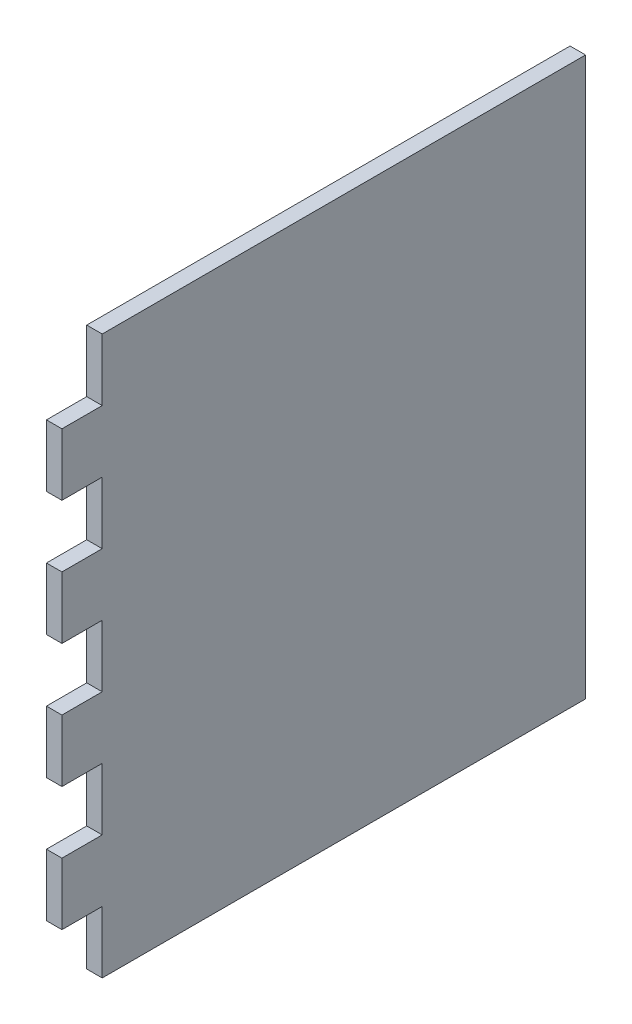
ISO-10303-21;
HEADER;
FILE_DESCRIPTION(('STEP AP214'),'2;1');
FILE_NAME('part.step','',(''),(''),'','','');
FILE_SCHEMA(('AUTOMOTIVE_DESIGN { 1 0 10303 214 1 1 1 1 }'));
ENDSEC;
DATA;
#1=APPLICATION_CONTEXT('core data for automotive mechanical design processes');
#2=APPLICATION_PROTOCOL_DEFINITION('international standard','automotive_design',2000,#1);
#3=PRODUCT_CONTEXT('',#1,'mechanical');
#4=PRODUCT('Part','Part','',(#3));
#5=PRODUCT_RELATED_PRODUCT_CATEGORY('part','',(#4));
#6=PRODUCT_DEFINITION_FORMATION('','',#4);
#7=PRODUCT_DEFINITION_CONTEXT('part definition',#1,'design');
#8=PRODUCT_DEFINITION('design','',#6,#7);
#9=PRODUCT_DEFINITION_SHAPE('','',#8);
#10=(LENGTH_UNIT() NAMED_UNIT(*) SI_UNIT(.MILLI.,.METRE.));
#11=(NAMED_UNIT(*) PLANE_ANGLE_UNIT() SI_UNIT($,.RADIAN.));
#12=(NAMED_UNIT(*) SI_UNIT($,.STERADIAN.) SOLID_ANGLE_UNIT());
#13=UNCERTAINTY_MEASURE_WITH_UNIT(LENGTH_MEASURE(1.E-05),#10,'distance_accuracy_value','');
#14=(GEOMETRIC_REPRESENTATION_CONTEXT(3) GLOBAL_UNCERTAINTY_ASSIGNED_CONTEXT((#13)) GLOBAL_UNIT_ASSIGNED_CONTEXT((#10,
#11,#12)) REPRESENTATION_CONTEXT('',''));
#15=CARTESIAN_POINT('',(0.,0.,0.));
#16=DIRECTION('',(0.,0.,1.));
#17=DIRECTION('',(1.,0.,0.));
#18=AXIS2_PLACEMENT_3D('',#15,#16,#17);
#19=CARTESIAN_POINT('',(6.35,-114.3,-99.06));
#20=DIRECTION('',(0.,0.,1.));
#21=DIRECTION('',(1.,0.,0.));
#22=AXIS2_PLACEMENT_3D('',#19,#20,#21);
#23=PLANE('',#22);
#24=DIRECTION('',(0.,1.,0.));
#25=VECTOR('',#24,1.);
#26=CARTESIAN_POINT('',(0.,-114.3,-99.06));
#27=LINE('',#26,#25);
#28=CARTESIAN_POINT('',(0.,-114.3,-99.06));
#29=VERTEX_POINT('',#28);
#30=CARTESIAN_POINT('',(0.,114.3,-99.06));
#31=VERTEX_POINT('',#30);
#32=EDGE_CURVE('E201',#29,#31,#27,.T.);
#33=ORIENTED_EDGE('',*,*,#32,.T.);
#34=DIRECTION('',(-1.,0.,0.));
#35=VECTOR('',#34,1.);
#36=CARTESIAN_POINT('',(6.35,114.3,-99.06));
#37=LINE('',#36,#35);
#38=CARTESIAN_POINT('',(6.35,114.3,-99.06));
#39=VERTEX_POINT('',#38);
#40=EDGE_CURVE('E11',#39,#31,#37,.T.);
#41=ORIENTED_EDGE('',*,*,#40,.F.);
#42=DIRECTION('',(0.,1.,0.));
#43=VECTOR('',#42,1.);
#44=CARTESIAN_POINT('',(6.35,-114.3,-99.06));
#45=LINE('',#44,#43);
#46=CARTESIAN_POINT('',(6.35,-114.3,-99.06));
#47=VERTEX_POINT('',#46);
#48=EDGE_CURVE('E239',#47,#39,#45,.T.);
#49=ORIENTED_EDGE('',*,*,#48,.F.);
#50=DIRECTION('',(-1.,0.,0.));
#51=VECTOR('',#50,1.);
#52=CARTESIAN_POINT('',(6.35,-114.3,-99.06));
#53=LINE('',#52,#51);
#54=EDGE_CURVE('E197',#47,#29,#53,.T.);
#55=ORIENTED_EDGE('',*,*,#54,.T.);
#56=EDGE_LOOP('',(#33,#41,#49,#55));
#57=FACE_BOUND('',#56,.T.);
#58=ADVANCED_FACE('F33',(#57),#23,.F.);
#59=CARTESIAN_POINT('',(6.35,114.3,99.06));
#60=DIRECTION('',(0.,-1.,0.));
#61=DIRECTION('',(0.,0.,-1.));
#62=AXIS2_PLACEMENT_3D('',#59,#60,#61);
#63=PLANE('',#62);
#64=DIRECTION('',(0.,0.,1.));
#65=VECTOR('',#64,1.);
#66=CARTESIAN_POINT('',(0.,114.3,99.06));
#67=LINE('',#66,#65);
#68=CARTESIAN_POINT('',(0.,114.3,99.06));
#69=VERTEX_POINT('',#68);
#70=EDGE_CURVE('E204',#31,#69,#67,.T.);
#71=ORIENTED_EDGE('',*,*,#70,.T.);
#72=DIRECTION('',(-1.,0.,0.));
#73=VECTOR('',#72,1.);
#74=CARTESIAN_POINT('',(6.35,114.3,99.06));
#75=LINE('',#74,#73);
#76=CARTESIAN_POINT('',(6.35,114.3,99.06));
#77=VERTEX_POINT('',#76);
#78=EDGE_CURVE('E41',#77,#69,#75,.T.);
#79=ORIENTED_EDGE('',*,*,#78,.F.);
#80=DIRECTION('',(0.,0.,1.));
#81=VECTOR('',#80,1.);
#82=CARTESIAN_POINT('',(6.35,114.3,99.06));
#83=LINE('',#82,#81);
#84=EDGE_CURVE('E128',#39,#77,#83,.T.);
#85=ORIENTED_EDGE('',*,*,#84,.F.);
#86=ORIENTED_EDGE('',*,*,#40,.T.);
#87=EDGE_LOOP('',(#71,#79,#85,#86));
#88=FACE_BOUND('',#87,.T.);
#89=ADVANCED_FACE('F357',(#88),#63,.F.);
#90=CARTESIAN_POINT('',(6.35,88.9,99.06));
#91=DIRECTION('',(0.,0.,-1.));
#92=DIRECTION('',(-1.,0.,0.));
#93=AXIS2_PLACEMENT_3D('',#90,#91,#92);
#94=PLANE('',#93);
#95=DIRECTION('',(0.,-1.,0.));
#96=VECTOR('',#95,1.);
#97=CARTESIAN_POINT('',(0.,88.9,99.06));
#98=LINE('',#97,#96);
#99=CARTESIAN_POINT('',(0.,88.9,99.06));
#100=VERTEX_POINT('',#99);
#101=EDGE_CURVE('E206',#69,#100,#98,.T.);
#102=ORIENTED_EDGE('',*,*,#101,.T.);
#103=DIRECTION('',(-1.,0.,0.));
#104=VECTOR('',#103,1.);
#105=CARTESIAN_POINT('',(6.35,88.9,99.06));
#106=LINE('',#105,#104);
#107=CARTESIAN_POINT('',(6.35,88.9,99.06));
#108=VERTEX_POINT('',#107);
#109=EDGE_CURVE('E282',#108,#100,#106,.T.);
#110=ORIENTED_EDGE('',*,*,#109,.F.);
#111=DIRECTION('',(0.,-1.,0.));
#112=VECTOR('',#111,1.);
#113=CARTESIAN_POINT('',(6.35,88.9,99.06));
#114=LINE('',#113,#112);
#115=EDGE_CURVE('E290',#77,#108,#114,.T.);
#116=ORIENTED_EDGE('',*,*,#115,.F.);
#117=ORIENTED_EDGE('',*,*,#78,.T.);
#118=EDGE_LOOP('',(#102,#110,#116,#117));
#119=FACE_BOUND('',#118,.T.);
#120=ADVANCED_FACE('F288',(#119),#94,.F.);
#121=CARTESIAN_POINT('',(6.35,88.9,99.06));
#122=DIRECTION('',(0.,-1.,0.));
#123=DIRECTION('',(0.,0.,-1.));
#124=AXIS2_PLACEMENT_3D('',#121,#122,#123);
#125=PLANE('',#124);
#126=DIRECTION('',(0.,0.,1.));
#127=VECTOR('',#126,1.);
#128=CARTESIAN_POINT('',(0.,88.9,99.06));
#129=LINE('',#128,#127);
#130=CARTESIAN_POINT('',(0.,88.9,115.57));
#131=VERTEX_POINT('',#130);
#132=EDGE_CURVE('E208',#100,#131,#129,.T.);
#133=ORIENTED_EDGE('',*,*,#132,.T.);
#134=DIRECTION('',(-1.,0.,0.));
#135=VECTOR('',#134,1.);
#136=CARTESIAN_POINT('',(6.35,88.9,115.57));
#137=LINE('',#136,#135);
#138=CARTESIAN_POINT('',(6.35,88.9,115.57));
#139=VERTEX_POINT('',#138);
#140=EDGE_CURVE('E279',#139,#131,#137,.T.);
#141=ORIENTED_EDGE('',*,*,#140,.F.);
#142=DIRECTION('',(0.,0.,1.));
#143=VECTOR('',#142,1.);
#144=CARTESIAN_POINT('',(6.35,88.9,99.06));
#145=LINE('',#144,#143);
#146=EDGE_CURVE('E308',#108,#139,#145,.T.);
#147=ORIENTED_EDGE('',*,*,#146,.F.);
#148=ORIENTED_EDGE('',*,*,#109,.T.);
#149=EDGE_LOOP('',(#133,#141,#147,#148));
#150=FACE_BOUND('',#149,.T.);
#151=ADVANCED_FACE('F299',(#150),#125,.F.);
#152=CARTESIAN_POINT('',(6.35,88.9,115.57));
#153=DIRECTION('',(0.,0.,-1.));
#154=DIRECTION('',(0.,1.,0.));
#155=AXIS2_PLACEMENT_3D('',#152,#153,#154);
#156=PLANE('',#155);
#157=DIRECTION('',(0.,-1.,0.));
#158=VECTOR('',#157,1.);
#159=CARTESIAN_POINT('',(0.,88.9,115.57));
#160=LINE('',#159,#158);
#161=CARTESIAN_POINT('',(0.,63.5,115.57));
#162=VERTEX_POINT('',#161);
#163=EDGE_CURVE('E210',#131,#162,#160,.T.);
#164=ORIENTED_EDGE('',*,*,#163,.T.);
#165=DIRECTION('',(-1.,0.,0.));
#166=VECTOR('',#165,1.);
#167=CARTESIAN_POINT('',(6.35,63.5,115.57));
#168=LINE('',#167,#166);
#169=CARTESIAN_POINT('',(6.35,63.5,115.57));
#170=VERTEX_POINT('',#169);
#171=EDGE_CURVE('E276',#170,#162,#168,.T.);
#172=ORIENTED_EDGE('',*,*,#171,.F.);
#173=DIRECTION('',(0.,-1.,0.));
#174=VECTOR('',#173,1.);
#175=CARTESIAN_POINT('',(6.35,88.9,115.57));
#176=LINE('',#175,#174);
#177=EDGE_CURVE('E305',#139,#170,#176,.T.);
#178=ORIENTED_EDGE('',*,*,#177,.F.);
#179=ORIENTED_EDGE('',*,*,#140,.T.);
#180=EDGE_LOOP('',(#164,#172,#178,#179));
#181=FACE_BOUND('',#180,.T.);
#182=ADVANCED_FACE('F303',(#181),#156,.F.);
#183=CARTESIAN_POINT('',(6.35,63.5,99.06));
#184=DIRECTION('',(0.,1.,0.));
#185=DIRECTION('',(0.,0.,1.));
#186=AXIS2_PLACEMENT_3D('',#183,#184,#185);
#187=PLANE('',#186);
#188=DIRECTION('',(0.,0.,-1.));
#189=VECTOR('',#188,1.);
#190=CARTESIAN_POINT('',(0.,63.5,99.06));
#191=LINE('',#190,#189);
#192=CARTESIAN_POINT('',(0.,63.5,99.06));
#193=VERTEX_POINT('',#192);
#194=EDGE_CURVE('E212',#162,#193,#191,.T.);
#195=ORIENTED_EDGE('',*,*,#194,.T.);
#196=DIRECTION('',(-1.,0.,0.));
#197=VECTOR('',#196,1.);
#198=CARTESIAN_POINT('',(6.35,63.5,99.06));
#199=LINE('',#198,#197);
#200=CARTESIAN_POINT('',(6.35,63.5,99.06));
#201=VERTEX_POINT('',#200);
#202=EDGE_CURVE('E273',#201,#193,#199,.T.);
#203=ORIENTED_EDGE('',*,*,#202,.F.);
#204=DIRECTION('',(0.,0.,-1.));
#205=VECTOR('',#204,1.);
#206=CARTESIAN_POINT('',(6.35,63.5,99.06));
#207=LINE('',#206,#205);
#208=EDGE_CURVE('E307',#170,#201,#207,.T.);
#209=ORIENTED_EDGE('',*,*,#208,.F.);
#210=ORIENTED_EDGE('',*,*,#171,.T.);
#211=EDGE_LOOP('',(#195,#203,#209,#210));
#212=FACE_BOUND('',#211,.T.);
#213=ADVANCED_FACE('F370',(#212),#187,.F.);
#214=CARTESIAN_POINT('',(6.35,38.1,99.0599999999995));
#215=DIRECTION('',(0.,0.,-1.));
#216=DIRECTION('',(0.,1.,0.));
#217=AXIS2_PLACEMENT_3D('',#214,#215,#216);
#218=PLANE('',#217);
#219=DIRECTION('',(0.,-1.,0.));
#220=VECTOR('',#219,1.);
#221=CARTESIAN_POINT('',(0.,38.1,99.0599999999995));
#222=LINE('',#221,#220);
#223=CARTESIAN_POINT('',(0.,38.1,99.0599999999995));
#224=VERTEX_POINT('',#223);
#225=EDGE_CURVE('E214',#193,#224,#222,.T.);
#226=ORIENTED_EDGE('',*,*,#225,.T.);
#227=DIRECTION('',(-1.,0.,0.));
#228=VECTOR('',#227,1.);
#229=CARTESIAN_POINT('',(6.35,38.1,99.0599999999995));
#230=LINE('',#229,#228);
#231=CARTESIAN_POINT('',(6.35,38.1,99.0599999999995));
#232=VERTEX_POINT('',#231);
#233=EDGE_CURVE('E270',#232,#224,#230,.T.);
#234=ORIENTED_EDGE('',*,*,#233,.F.);
#235=DIRECTION('',(0.,-1.,0.));
#236=VECTOR('',#235,1.);
#237=CARTESIAN_POINT('',(6.35,38.1,99.0599999999995));
#238=LINE('',#237,#236);
#239=EDGE_CURVE('E310',#201,#232,#238,.T.);
#240=ORIENTED_EDGE('',*,*,#239,.F.);
#241=ORIENTED_EDGE('',*,*,#202,.T.);
#242=EDGE_LOOP('',(#226,#234,#240,#241));
#243=FACE_BOUND('',#242,.T.);
#244=ADVANCED_FACE('F373',(#243),#218,.F.);
#245=CARTESIAN_POINT('',(6.35,38.1,99.0599999999995));
#246=DIRECTION('',(0.,-1.,0.));
#247=DIRECTION('',(0.,0.,-1.));
#248=AXIS2_PLACEMENT_3D('',#245,#246,#247);
#249=PLANE('',#248);
#250=DIRECTION('',(0.,0.,1.));
#251=VECTOR('',#250,1.);
#252=CARTESIAN_POINT('',(0.,38.1,99.0599999999995));
#253=LINE('',#252,#251);
#254=CARTESIAN_POINT('',(0.,38.1,115.569999999999));
#255=VERTEX_POINT('',#254);
#256=EDGE_CURVE('E216',#224,#255,#253,.T.);
#257=ORIENTED_EDGE('',*,*,#256,.T.);
#258=DIRECTION('',(-1.,0.,0.));
#259=VECTOR('',#258,1.);
#260=CARTESIAN_POINT('',(6.35,38.1,115.569999999999));
#261=LINE('',#260,#259);
#262=CARTESIAN_POINT('',(6.35,38.1,115.569999999999));
#263=VERTEX_POINT('',#262);
#264=EDGE_CURVE('E267',#263,#255,#261,.T.);
#265=ORIENTED_EDGE('',*,*,#264,.F.);
#266=DIRECTION('',(0.,0.,1.));
#267=VECTOR('',#266,1.);
#268=CARTESIAN_POINT('',(6.35,38.1,99.0599999999995));
#269=LINE('',#268,#267);
#270=EDGE_CURVE('E316',#232,#263,#269,.T.);
#271=ORIENTED_EDGE('',*,*,#270,.F.);
#272=ORIENTED_EDGE('',*,*,#233,.T.);
#273=EDGE_LOOP('',(#257,#265,#271,#272));
#274=FACE_BOUND('',#273,.T.);
#275=ADVANCED_FACE('F377',(#274),#249,.F.);
#276=CARTESIAN_POINT('',(6.35,38.1,115.569999999999));
#277=DIRECTION('',(0.,0.,-1.));
#278=DIRECTION('',(0.,1.,0.));
#279=AXIS2_PLACEMENT_3D('',#276,#277,#278);
#280=PLANE('',#279);
#281=DIRECTION('',(0.,-1.,0.));
#282=VECTOR('',#281,1.);
#283=CARTESIAN_POINT('',(0.,38.1,115.569999999999));
#284=LINE('',#283,#282);
#285=CARTESIAN_POINT('',(0.,12.7,115.569999999999));
#286=VERTEX_POINT('',#285);
#287=EDGE_CURVE('E218',#255,#286,#284,.T.);
#288=ORIENTED_EDGE('',*,*,#287,.T.);
#289=DIRECTION('',(-1.,0.,0.));
#290=VECTOR('',#289,1.);
#291=CARTESIAN_POINT('',(6.35,12.7,115.569999999999));
#292=LINE('',#291,#290);
#293=CARTESIAN_POINT('',(6.35,12.7,115.569999999999));
#294=VERTEX_POINT('',#293);
#295=EDGE_CURVE('E264',#294,#286,#292,.T.);
#296=ORIENTED_EDGE('',*,*,#295,.F.);
#297=DIRECTION('',(0.,-1.,0.));
#298=VECTOR('',#297,1.);
#299=CARTESIAN_POINT('',(6.35,38.1,115.569999999999));
#300=LINE('',#299,#298);
#301=EDGE_CURVE('E318',#263,#294,#300,.T.);
#302=ORIENTED_EDGE('',*,*,#301,.F.);
#303=ORIENTED_EDGE('',*,*,#264,.T.);
#304=EDGE_LOOP('',(#288,#296,#302,#303));
#305=FACE_BOUND('',#304,.T.);
#306=ADVANCED_FACE('F381',(#305),#280,.F.);
#307=CARTESIAN_POINT('',(6.35,12.7,99.0599999999995));
#308=DIRECTION('',(0.,1.,0.));
#309=DIRECTION('',(0.,0.,1.));
#310=AXIS2_PLACEMENT_3D('',#307,#308,#309);
#311=PLANE('',#310);
#312=DIRECTION('',(0.,0.,-1.));
#313=VECTOR('',#312,1.);
#314=CARTESIAN_POINT('',(0.,12.7,99.0599999999995));
#315=LINE('',#314,#313);
#316=CARTESIAN_POINT('',(0.,12.7,99.0599999999995));
#317=VERTEX_POINT('',#316);
#318=EDGE_CURVE('E220',#286,#317,#315,.T.);
#319=ORIENTED_EDGE('',*,*,#318,.T.);
#320=DIRECTION('',(-1.,0.,0.));
#321=VECTOR('',#320,1.);
#322=CARTESIAN_POINT('',(6.35,12.7,99.0599999999995));
#323=LINE('',#322,#321);
#324=CARTESIAN_POINT('',(6.35,12.7,99.0599999999995));
#325=VERTEX_POINT('',#324);
#326=EDGE_CURVE('E261',#325,#317,#323,.T.);
#327=ORIENTED_EDGE('',*,*,#326,.F.);
#328=DIRECTION('',(0.,0.,-1.));
#329=VECTOR('',#328,1.);
#330=CARTESIAN_POINT('',(6.35,12.7,99.0599999999995));
#331=LINE('',#330,#329);
#332=EDGE_CURVE('E320',#294,#325,#331,.T.);
#333=ORIENTED_EDGE('',*,*,#332,.F.);
#334=ORIENTED_EDGE('',*,*,#295,.T.);
#335=EDGE_LOOP('',(#319,#327,#333,#334));
#336=FACE_BOUND('',#335,.T.);
#337=ADVANCED_FACE('F385',(#336),#311,.F.);
#338=CARTESIAN_POINT('',(6.35,-12.7,99.0599999999989));
#339=DIRECTION('',(0.,0.,-1.));
#340=DIRECTION('',(0.,1.,0.));
#341=AXIS2_PLACEMENT_3D('',#338,#339,#340);
#342=PLANE('',#341);
#343=DIRECTION('',(0.,-1.,0.));
#344=VECTOR('',#343,1.);
#345=CARTESIAN_POINT('',(0.,-12.7,99.0599999999989));
#346=LINE('',#345,#344);
#347=CARTESIAN_POINT('',(0.,-12.7,99.0599999999989));
#348=VERTEX_POINT('',#347);
#349=EDGE_CURVE('E222',#317,#348,#346,.T.);
#350=ORIENTED_EDGE('',*,*,#349,.T.);
#351=DIRECTION('',(-1.,0.,0.));
#352=VECTOR('',#351,1.);
#353=CARTESIAN_POINT('',(6.35,-12.7,99.0599999999989));
#354=LINE('',#353,#352);
#355=CARTESIAN_POINT('',(6.35,-12.7,99.0599999999989));
#356=VERTEX_POINT('',#355);
#357=EDGE_CURVE('E258',#356,#348,#354,.T.);
#358=ORIENTED_EDGE('',*,*,#357,.F.);
#359=DIRECTION('',(0.,-1.,0.));
#360=VECTOR('',#359,1.);
#361=CARTESIAN_POINT('',(6.35,-12.7,99.0599999999989));
#362=LINE('',#361,#360);
#363=EDGE_CURVE('E322',#325,#356,#362,.T.);
#364=ORIENTED_EDGE('',*,*,#363,.F.);
#365=ORIENTED_EDGE('',*,*,#326,.T.);
#366=EDGE_LOOP('',(#350,#358,#364,#365));
#367=FACE_BOUND('',#366,.T.);
#368=ADVANCED_FACE('F389',(#367),#342,.F.);
#369=CARTESIAN_POINT('',(6.35,-12.7,99.0599999999989));
#370=DIRECTION('',(0.,-1.,0.));
#371=DIRECTION('',(0.,0.,-1.));
#372=AXIS2_PLACEMENT_3D('',#369,#370,#371);
#373=PLANE('',#372);
#374=DIRECTION('',(0.,0.,1.));
#375=VECTOR('',#374,1.);
#376=CARTESIAN_POINT('',(0.,-12.7,99.0599999999989));
#377=LINE('',#376,#375);
#378=CARTESIAN_POINT('',(0.,-12.7,115.569999999999));
#379=VERTEX_POINT('',#378);
#380=EDGE_CURVE('E224',#348,#379,#377,.T.);
#381=ORIENTED_EDGE('',*,*,#380,.T.);
#382=DIRECTION('',(-1.,0.,0.));
#383=VECTOR('',#382,1.);
#384=CARTESIAN_POINT('',(6.35,-12.7,115.569999999999));
#385=LINE('',#384,#383);
#386=CARTESIAN_POINT('',(6.35,-12.7,115.569999999999));
#387=VERTEX_POINT('',#386);
#388=EDGE_CURVE('E255',#387,#379,#385,.T.);
#389=ORIENTED_EDGE('',*,*,#388,.F.);
#390=DIRECTION('',(0.,0.,1.));
#391=VECTOR('',#390,1.);
#392=CARTESIAN_POINT('',(6.35,-12.7,99.0599999999989));
#393=LINE('',#392,#391);
#394=EDGE_CURVE('E324',#356,#387,#393,.T.);
#395=ORIENTED_EDGE('',*,*,#394,.F.);
#396=ORIENTED_EDGE('',*,*,#357,.T.);
#397=EDGE_LOOP('',(#381,#389,#395,#396));
#398=FACE_BOUND('',#397,.T.);
#399=ADVANCED_FACE('F393',(#398),#373,.F.);
#400=CARTESIAN_POINT('',(6.35,-12.7,115.569999999999));
#401=DIRECTION('',(0.,0.,-1.));
#402=DIRECTION('',(0.,1.,0.));
#403=AXIS2_PLACEMENT_3D('',#400,#401,#402);
#404=PLANE('',#403);
#405=DIRECTION('',(0.,-1.,0.));
#406=VECTOR('',#405,1.);
#407=CARTESIAN_POINT('',(0.,-12.7,115.569999999999));
#408=LINE('',#407,#406);
#409=CARTESIAN_POINT('',(0.,-38.1,115.569999999999));
#410=VERTEX_POINT('',#409);
#411=EDGE_CURVE('E226',#379,#410,#408,.T.);
#412=ORIENTED_EDGE('',*,*,#411,.T.);
#413=DIRECTION('',(-1.,0.,0.));
#414=VECTOR('',#413,1.);
#415=CARTESIAN_POINT('',(6.35,-38.1,115.569999999999));
#416=LINE('',#415,#414);
#417=CARTESIAN_POINT('',(6.35,-38.1,115.569999999999));
#418=VERTEX_POINT('',#417);
#419=EDGE_CURVE('E252',#418,#410,#416,.T.);
#420=ORIENTED_EDGE('',*,*,#419,.F.);
#421=DIRECTION('',(0.,-1.,0.));
#422=VECTOR('',#421,1.);
#423=CARTESIAN_POINT('',(6.35,-12.7,115.569999999999));
#424=LINE('',#423,#422);
#425=EDGE_CURVE('E326',#387,#418,#424,.T.);
#426=ORIENTED_EDGE('',*,*,#425,.F.);
#427=ORIENTED_EDGE('',*,*,#388,.T.);
#428=EDGE_LOOP('',(#412,#420,#426,#427));
#429=FACE_BOUND('',#428,.T.);
#430=ADVANCED_FACE('F397',(#429),#404,.F.);
#431=CARTESIAN_POINT('',(6.35,-38.1,99.0599999999989));
#432=DIRECTION('',(0.,1.,0.));
#433=DIRECTION('',(0.,0.,1.));
#434=AXIS2_PLACEMENT_3D('',#431,#432,#433);
#435=PLANE('',#434);
#436=DIRECTION('',(0.,0.,-1.));
#437=VECTOR('',#436,1.);
#438=CARTESIAN_POINT('',(0.,-38.1,99.0599999999989));
#439=LINE('',#438,#437);
#440=CARTESIAN_POINT('',(0.,-38.1,99.0599999999989));
#441=VERTEX_POINT('',#440);
#442=EDGE_CURVE('E228',#410,#441,#439,.T.);
#443=ORIENTED_EDGE('',*,*,#442,.T.);
#444=DIRECTION('',(-1.,0.,0.));
#445=VECTOR('',#444,1.);
#446=CARTESIAN_POINT('',(6.35,-38.1,99.0599999999989));
#447=LINE('',#446,#445);
#448=CARTESIAN_POINT('',(6.35,-38.1,99.0599999999989));
#449=VERTEX_POINT('',#448);
#450=EDGE_CURVE('E249',#449,#441,#447,.T.);
#451=ORIENTED_EDGE('',*,*,#450,.F.);
#452=DIRECTION('',(0.,0.,-1.));
#453=VECTOR('',#452,1.);
#454=CARTESIAN_POINT('',(6.35,-38.1,99.0599999999989));
#455=LINE('',#454,#453);
#456=EDGE_CURVE('E328',#418,#449,#455,.T.);
#457=ORIENTED_EDGE('',*,*,#456,.F.);
#458=ORIENTED_EDGE('',*,*,#419,.T.);
#459=EDGE_LOOP('',(#443,#451,#457,#458));
#460=FACE_BOUND('',#459,.T.);
#461=ADVANCED_FACE('F401',(#460),#435,.F.);
#462=CARTESIAN_POINT('',(6.35,-63.5,99.0599999999984));
#463=DIRECTION('',(0.,0.,-1.));
#464=DIRECTION('',(0.,1.,0.));
#465=AXIS2_PLACEMENT_3D('',#462,#463,#464);
#466=PLANE('',#465);
#467=DIRECTION('',(0.,-1.,0.));
#468=VECTOR('',#467,1.);
#469=CARTESIAN_POINT('',(0.,-63.5,99.0599999999984));
#470=LINE('',#469,#468);
#471=CARTESIAN_POINT('',(0.,-63.5,99.0599999999984));
#472=VERTEX_POINT('',#471);
#473=EDGE_CURVE('E230',#441,#472,#470,.T.);
#474=ORIENTED_EDGE('',*,*,#473,.T.);
#475=DIRECTION('',(-1.,0.,0.));
#476=VECTOR('',#475,1.);
#477=CARTESIAN_POINT('',(6.35,-63.5,99.0599999999984));
#478=LINE('',#477,#476);
#479=CARTESIAN_POINT('',(6.35,-63.5,99.0599999999984));
#480=VERTEX_POINT('',#479);
#481=EDGE_CURVE('E246',#480,#472,#478,.T.);
#482=ORIENTED_EDGE('',*,*,#481,.F.);
#483=DIRECTION('',(0.,-1.,0.));
#484=VECTOR('',#483,1.);
#485=CARTESIAN_POINT('',(6.35,-63.5,99.0599999999984));
#486=LINE('',#485,#484);
#487=EDGE_CURVE('E330',#449,#480,#486,.T.);
#488=ORIENTED_EDGE('',*,*,#487,.F.);
#489=ORIENTED_EDGE('',*,*,#450,.T.);
#490=EDGE_LOOP('',(#474,#482,#488,#489));
#491=FACE_BOUND('',#490,.T.);
#492=ADVANCED_FACE('F405',(#491),#466,.F.);
#493=CARTESIAN_POINT('',(6.35,-63.5,99.0599999999984));
#494=DIRECTION('',(0.,-1.,0.));
#495=DIRECTION('',(0.,0.,-1.));
#496=AXIS2_PLACEMENT_3D('',#493,#494,#495);
#497=PLANE('',#496);
#498=DIRECTION('',(0.,0.,1.));
#499=VECTOR('',#498,1.);
#500=CARTESIAN_POINT('',(0.,-63.5,99.0599999999984));
#501=LINE('',#500,#499);
#502=CARTESIAN_POINT('',(0.,-63.5,115.569999999998));
#503=VERTEX_POINT('',#502);
#504=EDGE_CURVE('E232',#472,#503,#501,.T.);
#505=ORIENTED_EDGE('',*,*,#504,.T.);
#506=DIRECTION('',(-1.,0.,0.));
#507=VECTOR('',#506,1.);
#508=CARTESIAN_POINT('',(6.35,-63.5,115.569999999998));
#509=LINE('',#508,#507);
#510=CARTESIAN_POINT('',(6.35,-63.5,115.569999999998));
#511=VERTEX_POINT('',#510);
#512=EDGE_CURVE('E243',#511,#503,#509,.T.);
#513=ORIENTED_EDGE('',*,*,#512,.F.);
#514=DIRECTION('',(0.,0.,1.));
#515=VECTOR('',#514,1.);
#516=CARTESIAN_POINT('',(6.35,-63.5,99.0599999999984));
#517=LINE('',#516,#515);
#518=EDGE_CURVE('E332',#480,#511,#517,.T.);
#519=ORIENTED_EDGE('',*,*,#518,.F.);
#520=ORIENTED_EDGE('',*,*,#481,.T.);
#521=EDGE_LOOP('',(#505,#513,#519,#520));
#522=FACE_BOUND('',#521,.T.);
#523=ADVANCED_FACE('F338',(#522),#497,.F.);
#524=CARTESIAN_POINT('',(6.35,-63.5,115.569999999998));
#525=DIRECTION('',(0.,0.,-1.));
#526=DIRECTION('',(0.,1.,0.));
#527=AXIS2_PLACEMENT_3D('',#524,#525,#526);
#528=PLANE('',#527);
#529=DIRECTION('',(0.,-1.,0.));
#530=VECTOR('',#529,1.);
#531=CARTESIAN_POINT('',(0.,-63.5,115.569999999998));
#532=LINE('',#531,#530);
#533=CARTESIAN_POINT('',(0.,-88.9,115.569999999998));
#534=VERTEX_POINT('',#533);
#535=EDGE_CURVE('E234',#503,#534,#532,.T.);
#536=ORIENTED_EDGE('',*,*,#535,.T.);
#537=DIRECTION('',(-1.,0.,0.));
#538=VECTOR('',#537,1.);
#539=CARTESIAN_POINT('',(6.35,-88.9,115.569999999998));
#540=LINE('',#539,#538);
#541=CARTESIAN_POINT('',(6.35,-88.9,115.569999999998));
#542=VERTEX_POINT('',#541);
#543=EDGE_CURVE('E192',#542,#534,#540,.T.);
#544=ORIENTED_EDGE('',*,*,#543,.F.);
#545=DIRECTION('',(0.,-1.,0.));
#546=VECTOR('',#545,1.);
#547=CARTESIAN_POINT('',(6.35,-63.5,115.569999999998));
#548=LINE('',#547,#546);
#549=EDGE_CURVE('E183',#511,#542,#548,.T.);
#550=ORIENTED_EDGE('',*,*,#549,.F.);
#551=ORIENTED_EDGE('',*,*,#512,.T.);
#552=EDGE_LOOP('',(#536,#544,#550,#551));
#553=FACE_BOUND('',#552,.T.);
#554=ADVANCED_FACE('F342',(#553),#528,.F.);
#555=CARTESIAN_POINT('',(6.35,-88.9,99.0599999999984));
#556=DIRECTION('',(0.,1.,0.));
#557=DIRECTION('',(0.,0.,1.));
#558=AXIS2_PLACEMENT_3D('',#555,#556,#557);
#559=PLANE('',#558);
#560=DIRECTION('',(0.,0.,-1.));
#561=VECTOR('',#560,1.);
#562=CARTESIAN_POINT('',(0.,-88.9,99.0599999999984));
#563=LINE('',#562,#561);
#564=CARTESIAN_POINT('',(0.,-88.9,99.0599999999984));
#565=VERTEX_POINT('',#564);
#566=EDGE_CURVE('E191',#534,#565,#563,.T.);
#567=ORIENTED_EDGE('',*,*,#566,.T.);
#568=DIRECTION('',(-1.,0.,0.));
#569=VECTOR('',#568,1.);
#570=CARTESIAN_POINT('',(6.35,-88.9,99.0599999999984));
#571=LINE('',#570,#569);
#572=CARTESIAN_POINT('',(6.35,-88.9,99.0599999999984));
#573=VERTEX_POINT('',#572);
#574=EDGE_CURVE('E188',#573,#565,#571,.T.);
#575=ORIENTED_EDGE('',*,*,#574,.F.);
#576=DIRECTION('',(0.,0.,-1.));
#577=VECTOR('',#576,1.);
#578=CARTESIAN_POINT('',(6.35,-88.9,99.0599999999984));
#579=LINE('',#578,#577);
#580=EDGE_CURVE('E177',#542,#573,#579,.T.);
#581=ORIENTED_EDGE('',*,*,#580,.F.);
#582=ORIENTED_EDGE('',*,*,#543,.T.);
#583=EDGE_LOOP('',(#567,#575,#581,#582));
#584=FACE_BOUND('',#583,.T.);
#585=ADVANCED_FACE('F189',(#584),#559,.F.);
#586=CARTESIAN_POINT('',(6.35,-114.3,99.06));
#587=DIRECTION('',(0.,0.,-1.));
#588=DIRECTION('',(0.,1.,0.));
#589=AXIS2_PLACEMENT_3D('',#586,#587,#588);
#590=PLANE('',#589);
#591=DIRECTION('',(0.,-1.,0.));
#592=VECTOR('',#591,1.);
#593=CARTESIAN_POINT('',(0.,-114.3,99.06));
#594=LINE('',#593,#592);
#595=CARTESIAN_POINT('',(0.,-114.3,99.06));
#596=VERTEX_POINT('',#595);
#597=EDGE_CURVE('E114',#565,#596,#594,.T.);
#598=ORIENTED_EDGE('',*,*,#597,.T.);
#599=DIRECTION('',(-1.,0.,0.));
#600=VECTOR('',#599,1.);
#601=CARTESIAN_POINT('',(6.35,-114.3,99.06));
#602=LINE('',#601,#600);
#603=CARTESIAN_POINT('',(6.35,-114.3,99.06));
#604=VERTEX_POINT('',#603);
#605=EDGE_CURVE('E193',#604,#596,#602,.T.);
#606=ORIENTED_EDGE('',*,*,#605,.F.);
#607=DIRECTION('',(0.,-1.,0.));
#608=VECTOR('',#607,1.);
#609=CARTESIAN_POINT('',(6.35,-114.3,99.06));
#610=LINE('',#609,#608);
#611=EDGE_CURVE('E181',#573,#604,#610,.T.);
#612=ORIENTED_EDGE('',*,*,#611,.F.);
#613=ORIENTED_EDGE('',*,*,#574,.T.);
#614=EDGE_LOOP('',(#598,#606,#612,#613));
#615=FACE_BOUND('',#614,.T.);
#616=ADVANCED_FACE('F195',(#615),#590,.F.);
#617=CARTESIAN_POINT('',(6.35,-114.3,99.06));
#618=DIRECTION('',(0.,1.,0.));
#619=DIRECTION('',(0.,0.,1.));
#620=AXIS2_PLACEMENT_3D('',#617,#618,#619);
#621=PLANE('',#620);
#622=DIRECTION('',(0.,0.,-1.));
#623=VECTOR('',#622,1.);
#624=CARTESIAN_POINT('',(0.,-114.3,99.06));
#625=LINE('',#624,#623);
#626=EDGE_CURVE('E120',#596,#29,#625,.T.);
#627=ORIENTED_EDGE('',*,*,#626,.T.);
#628=ORIENTED_EDGE('',*,*,#54,.F.);
#629=DIRECTION('',(0.,0.,-1.));
#630=VECTOR('',#629,1.);
#631=CARTESIAN_POINT('',(6.35,-114.3,99.06));
#632=LINE('',#631,#630);
#633=EDGE_CURVE('E49',#604,#47,#632,.T.);
#634=ORIENTED_EDGE('',*,*,#633,.F.);
#635=ORIENTED_EDGE('',*,*,#605,.T.);
#636=EDGE_LOOP('',(#627,#628,#634,#635));
#637=FACE_BOUND('',#636,.T.);
#638=ADVANCED_FACE('F346',(#637),#621,.F.);
#639=CARTESIAN_POINT('',(6.35,0.,0.));
#640=DIRECTION('',(-1.,0.,0.));
#641=DIRECTION('',(0.,0.,1.));
#642=AXIS2_PLACEMENT_3D('',#639,#640,#641);
#643=PLANE('',#642);
#644=ORIENTED_EDGE('',*,*,#48,.T.);
#645=ORIENTED_EDGE('',*,*,#84,.T.);
#646=ORIENTED_EDGE('',*,*,#115,.T.);
#647=ORIENTED_EDGE('',*,*,#146,.T.);
#648=ORIENTED_EDGE('',*,*,#177,.T.);
#649=ORIENTED_EDGE('',*,*,#208,.T.);
#650=ORIENTED_EDGE('',*,*,#239,.T.);
#651=ORIENTED_EDGE('',*,*,#270,.T.);
#652=ORIENTED_EDGE('',*,*,#301,.T.);
#653=ORIENTED_EDGE('',*,*,#332,.T.);
#654=ORIENTED_EDGE('',*,*,#363,.T.);
#655=ORIENTED_EDGE('',*,*,#394,.T.);
#656=ORIENTED_EDGE('',*,*,#425,.T.);
#657=ORIENTED_EDGE('',*,*,#456,.T.);
#658=ORIENTED_EDGE('',*,*,#487,.T.);
#659=ORIENTED_EDGE('',*,*,#518,.T.);
#660=ORIENTED_EDGE('',*,*,#549,.T.);
#661=ORIENTED_EDGE('',*,*,#580,.T.);
#662=ORIENTED_EDGE('',*,*,#611,.T.);
#663=ORIENTED_EDGE('',*,*,#633,.T.);
#664=EDGE_LOOP('',(#644,#645,#646,#647,#648,#649,#650,#651,#652,#653,#654,#655,#656,#657,#658,
#659,#660,#661,#662,#663));
#665=FACE_BOUND('',#664,.T.);
#666=ADVANCED_FACE('F179',(#665),#643,.F.);
#667=CARTESIAN_POINT('',(0.,0.,0.));
#668=DIRECTION('',(-1.,0.,0.));
#669=DIRECTION('',(0.,0.,1.));
#670=AXIS2_PLACEMENT_3D('',#667,#668,#669);
#671=PLANE('',#670);
#672=ORIENTED_EDGE('',*,*,#32,.F.);
#673=ORIENTED_EDGE('',*,*,#626,.F.);
#674=ORIENTED_EDGE('',*,*,#597,.F.);
#675=ORIENTED_EDGE('',*,*,#566,.F.);
#676=ORIENTED_EDGE('',*,*,#535,.F.);
#677=ORIENTED_EDGE('',*,*,#504,.F.);
#678=ORIENTED_EDGE('',*,*,#473,.F.);
#679=ORIENTED_EDGE('',*,*,#442,.F.);
#680=ORIENTED_EDGE('',*,*,#411,.F.);
#681=ORIENTED_EDGE('',*,*,#380,.F.);
#682=ORIENTED_EDGE('',*,*,#349,.F.);
#683=ORIENTED_EDGE('',*,*,#318,.F.);
#684=ORIENTED_EDGE('',*,*,#287,.F.);
#685=ORIENTED_EDGE('',*,*,#256,.F.);
#686=ORIENTED_EDGE('',*,*,#225,.F.);
#687=ORIENTED_EDGE('',*,*,#194,.F.);
#688=ORIENTED_EDGE('',*,*,#163,.F.);
#689=ORIENTED_EDGE('',*,*,#132,.F.);
#690=ORIENTED_EDGE('',*,*,#101,.F.);
#691=ORIENTED_EDGE('',*,*,#70,.F.);
#692=EDGE_LOOP('',(#672,#673,#674,#675,#676,#677,#678,#679,#680,#681,#682,#683,#684,#685,#686,
#687,#688,#689,#690,#691));
#693=FACE_BOUND('',#692,.T.);
#694=ADVANCED_FACE('F294',(#693),#671,.T.);
#695=CLOSED_SHELL('',(#58,#89,#120,#151,#182,#213,#244,#275,#306,#337,#368,#399,#430,#461,#492,
#523,#554,#585,#616,#638,#666,#694));
#696=MANIFOLD_SOLID_BREP('B2',#695);
#697=ADVANCED_BREP_SHAPE_REPRESENTATION('',(#18,#696),#14);
#698=SHAPE_DEFINITION_REPRESENTATION(#9,#697);
ENDSEC;
END-ISO-10303-21;
